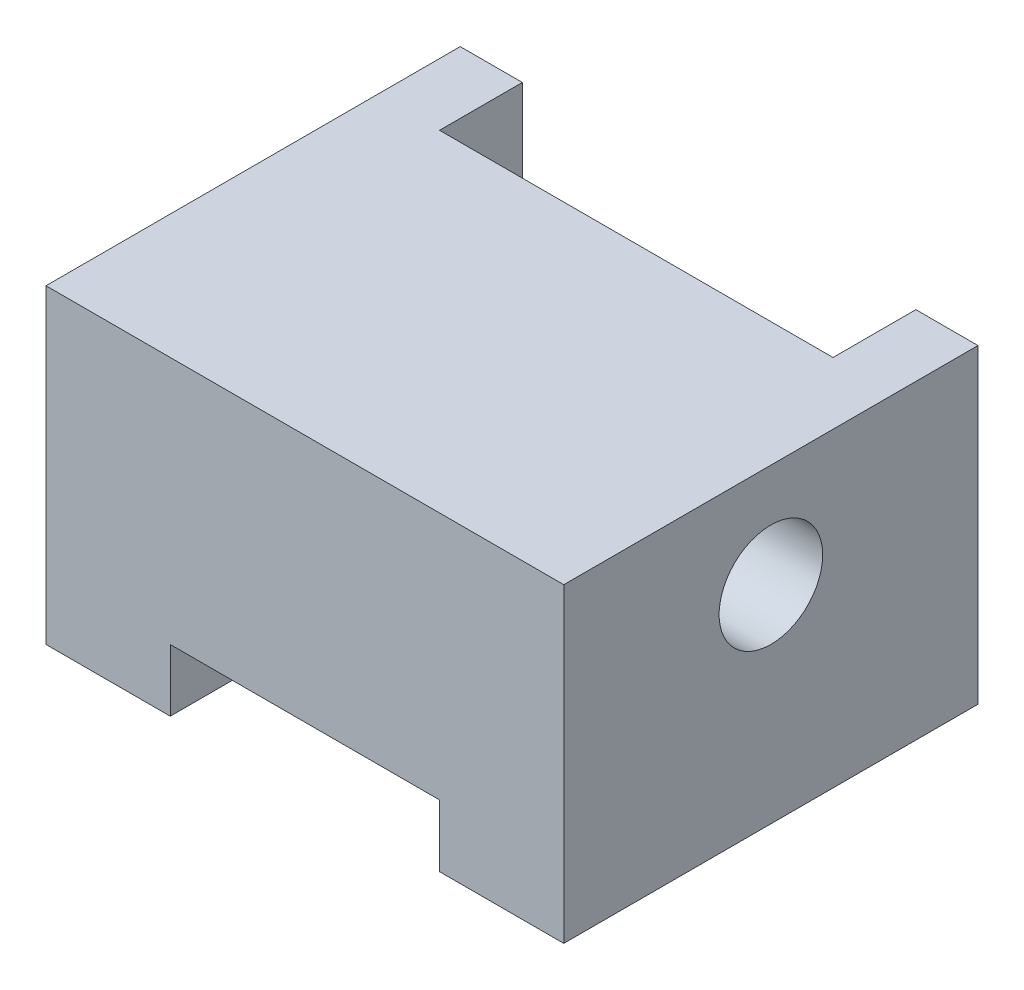
ISO-10303-21;
HEADER;
FILE_DESCRIPTION(('STEP AP214'),'2;1');
FILE_NAME('part.step','',(''),(''),'','','');
FILE_SCHEMA(('AUTOMOTIVE_DESIGN { 1 0 10303 214 1 1 1 1 }'));
ENDSEC;
DATA;
#1=APPLICATION_CONTEXT('core data for automotive mechanical design processes');
#2=APPLICATION_PROTOCOL_DEFINITION('international standard','automotive_design',2000,#1);
#3=PRODUCT_CONTEXT('',#1,'mechanical');
#4=PRODUCT('Part','Part','',(#3));
#5=PRODUCT_RELATED_PRODUCT_CATEGORY('part','',(#4));
#6=PRODUCT_DEFINITION_FORMATION('','',#4);
#7=PRODUCT_DEFINITION_CONTEXT('part definition',#1,'design');
#8=PRODUCT_DEFINITION('design','',#6,#7);
#9=PRODUCT_DEFINITION_SHAPE('','',#8);
#10=(LENGTH_UNIT() NAMED_UNIT(*) SI_UNIT(.MILLI.,.METRE.));
#11=(NAMED_UNIT(*) PLANE_ANGLE_UNIT() SI_UNIT($,.RADIAN.));
#12=(NAMED_UNIT(*) SI_UNIT($,.STERADIAN.) SOLID_ANGLE_UNIT());
#13=UNCERTAINTY_MEASURE_WITH_UNIT(LENGTH_MEASURE(1.E-05),#10,'distance_accuracy_value','');
#14=(GEOMETRIC_REPRESENTATION_CONTEXT(3) GLOBAL_UNCERTAINTY_ASSIGNED_CONTEXT((#13)) GLOBAL_UNIT_ASSIGNED_CONTEXT((#10,
#11,#12)) REPRESENTATION_CONTEXT('',''));
#15=CARTESIAN_POINT('',(0.,0.,0.));
#16=DIRECTION('',(0.,0.,1.));
#17=DIRECTION('',(1.,0.,0.));
#18=AXIS2_PLACEMENT_3D('',#15,#16,#17);
#19=CARTESIAN_POINT('',(0.,0.,-20.));
#20=DIRECTION('',(0.,0.,-1.));
#21=DIRECTION('',(-1.,0.,0.));
#22=AXIS2_PLACEMENT_3D('',#19,#20,#21);
#23=PLANE('',#22);
#24=DIRECTION('',(0.,1.,0.));
#25=VECTOR('',#24,1.);
#26=CARTESIAN_POINT('',(-19.,-15.,-20.));
#27=LINE('',#26,#25);
#28=CARTESIAN_POINT('',(-19.,-15.,-20.));
#29=VERTEX_POINT('',#28);
#30=CARTESIAN_POINT('',(-19.,15.,-20.));
#31=VERTEX_POINT('',#30);
#32=EDGE_CURVE('E167',#29,#31,#27,.T.);
#33=ORIENTED_EDGE('',*,*,#32,.F.);
#34=DIRECTION('',(1.,0.,0.));
#35=VECTOR('',#34,1.);
#36=CARTESIAN_POINT('',(-25.,-15.,-20.));
#37=LINE('',#36,#35);
#38=CARTESIAN_POINT('',(-25.,-15.,-20.));
#39=VERTEX_POINT('',#38);
#40=EDGE_CURVE('E153',#39,#29,#37,.T.);
#41=ORIENTED_EDGE('',*,*,#40,.F.);
#42=DIRECTION('',(0.,1.,0.));
#43=VECTOR('',#42,1.);
#44=CARTESIAN_POINT('',(-25.,-15.,-20.));
#45=LINE('',#44,#43);
#46=CARTESIAN_POINT('',(-25.,15.,-20.));
#47=VERTEX_POINT('',#46);
#48=EDGE_CURVE('E193',#39,#47,#45,.T.);
#49=ORIENTED_EDGE('',*,*,#48,.T.);
#50=DIRECTION('',(1.,0.,0.));
#51=VECTOR('',#50,1.);
#52=CARTESIAN_POINT('',(-25.,15.,-20.));
#53=LINE('',#52,#51);
#54=EDGE_CURVE('E207',#47,#31,#53,.T.);
#55=ORIENTED_EDGE('',*,*,#54,.T.);
#56=EDGE_LOOP('',(#33,#41,#49,#55));
#57=FACE_BOUND('',#56,.T.);
#58=ADVANCED_FACE('F37',(#57),#23,.T.);
#59=CARTESIAN_POINT('',(-25.,-15.,20.));
#60=DIRECTION('',(0.,1.,0.));
#61=DIRECTION('',(0.,0.,1.));
#62=AXIS2_PLACEMENT_3D('',#59,#60,#61);
#63=PLANE('',#62);
#64=ORIENTED_EDGE('',*,*,#40,.T.);
#65=DIRECTION('',(0.,0.,1.));
#66=VECTOR('',#65,1.);
#67=CARTESIAN_POINT('',(-19.,-15.,-20.));
#68=LINE('',#67,#66);
#69=CARTESIAN_POINT('',(-19.,-15.,-12.));
#70=VERTEX_POINT('',#69);
#71=EDGE_CURVE('E136',#29,#70,#68,.T.);
#72=ORIENTED_EDGE('',*,*,#71,.T.);
#73=DIRECTION('',(1.,0.,0.));
#74=VECTOR('',#73,1.);
#75=CARTESIAN_POINT('',(-19.,-15.,-12.));
#76=LINE('',#75,#74);
#77=CARTESIAN_POINT('',(-13.,-15.,-12.));
#78=VERTEX_POINT('',#77);
#79=EDGE_CURVE('E146',#70,#78,#76,.T.);
#80=ORIENTED_EDGE('',*,*,#79,.T.);
#81=DIRECTION('',(0.,0.,1.));
#82=VECTOR('',#81,1.);
#83=CARTESIAN_POINT('',(-13.,-15.,-20.));
#84=LINE('',#83,#82);
#85=CARTESIAN_POINT('',(-13.,-15.,20.));
#86=VERTEX_POINT('',#85);
#87=EDGE_CURVE('E185',#78,#86,#84,.T.);
#88=ORIENTED_EDGE('',*,*,#87,.T.);
#89=DIRECTION('',(1.,0.,0.));
#90=VECTOR('',#89,1.);
#91=CARTESIAN_POINT('',(-25.,-15.,20.));
#92=LINE('',#91,#90);
#93=CARTESIAN_POINT('',(-25.,-15.,20.));
#94=VERTEX_POINT('',#93);
#95=EDGE_CURVE('E201',#94,#86,#92,.T.);
#96=ORIENTED_EDGE('',*,*,#95,.F.);
#97=DIRECTION('',(0.,0.,-1.));
#98=VECTOR('',#97,1.);
#99=CARTESIAN_POINT('',(-25.,-15.,20.));
#100=LINE('',#99,#98);
#101=EDGE_CURVE('E45',#94,#39,#100,.T.);
#102=ORIENTED_EDGE('',*,*,#101,.T.);
#103=EDGE_LOOP('',(#64,#72,#80,#88,#96,#102));
#104=FACE_BOUND('',#103,.T.);
#105=ADVANCED_FACE('F152',(#104),#63,.F.);
#106=CARTESIAN_POINT('',(0.,0.,20.));
#107=DIRECTION('',(0.,0.,-1.));
#108=DIRECTION('',(-1.,0.,0.));
#109=AXIS2_PLACEMENT_3D('',#106,#107,#108);
#110=PLANE('',#109);
#111=DIRECTION('',(0.,1.,0.));
#112=VECTOR('',#111,1.);
#113=CARTESIAN_POINT('',(-13.,-15.,20.));
#114=LINE('',#113,#112);
#115=CARTESIAN_POINT('',(-13.,-9.,20.));
#116=VERTEX_POINT('',#115);
#117=EDGE_CURVE('E176',#86,#116,#114,.T.);
#118=ORIENTED_EDGE('',*,*,#117,.T.);
#119=DIRECTION('',(1.,0.,0.));
#120=VECTOR('',#119,1.);
#121=CARTESIAN_POINT('',(-13.,-9.,20.));
#122=LINE('',#121,#120);
#123=CARTESIAN_POINT('',(13.,-9.,20.));
#124=VERTEX_POINT('',#123);
#125=EDGE_CURVE('E179',#116,#124,#122,.T.);
#126=ORIENTED_EDGE('',*,*,#125,.T.);
#127=DIRECTION('',(0.,1.,0.));
#128=VECTOR('',#127,1.);
#129=CARTESIAN_POINT('',(13.,-15.,20.));
#130=LINE('',#129,#128);
#131=CARTESIAN_POINT('',(13.,-15.,20.));
#132=VERTEX_POINT('',#131);
#133=EDGE_CURVE('E182',#132,#124,#130,.T.);
#134=ORIENTED_EDGE('',*,*,#133,.F.);
#135=CARTESIAN_POINT('',(25.,-15.,20.));
#136=VERTEX_POINT('',#135);
#137=EDGE_CURVE('E200',#132,#136,#92,.T.);
#138=ORIENTED_EDGE('',*,*,#137,.T.);
#139=DIRECTION('',(0.,1.,0.));
#140=VECTOR('',#139,1.);
#141=CARTESIAN_POINT('',(25.,-15.,20.));
#142=LINE('',#141,#140);
#143=CARTESIAN_POINT('',(25.,15.,20.));
#144=VERTEX_POINT('',#143);
#145=EDGE_CURVE('E198',#136,#144,#142,.T.);
#146=ORIENTED_EDGE('',*,*,#145,.T.);
#147=DIRECTION('',(1.,0.,0.));
#148=VECTOR('',#147,1.);
#149=CARTESIAN_POINT('',(-25.,15.,20.));
#150=LINE('',#149,#148);
#151=CARTESIAN_POINT('',(-25.,15.,20.));
#152=VERTEX_POINT('',#151);
#153=EDGE_CURVE('E196',#152,#144,#150,.T.);
#154=ORIENTED_EDGE('',*,*,#153,.F.);
#155=DIRECTION('',(0.,1.,0.));
#156=VECTOR('',#155,1.);
#157=CARTESIAN_POINT('',(-25.,-15.,20.));
#158=LINE('',#157,#156);
#159=EDGE_CURVE('E194',#94,#152,#158,.T.);
#160=ORIENTED_EDGE('',*,*,#159,.F.);
#161=ORIENTED_EDGE('',*,*,#95,.T.);
#162=EDGE_LOOP('',(#118,#126,#134,#138,#146,#154,#160,#161));
#163=FACE_BOUND('',#162,.T.);
#164=ADVANCED_FACE('F230',(#163),#110,.F.);
#165=DIRECTION('',(0.,1.,0.));
#166=VECTOR('',#165,1.);
#167=CARTESIAN_POINT('',(19.,-15.,-20.));
#168=LINE('',#167,#166);
#169=CARTESIAN_POINT('',(19.,-15.,-20.));
#170=VERTEX_POINT('',#169);
#171=CARTESIAN_POINT('',(19.,15.,-20.));
#172=VERTEX_POINT('',#171);
#173=EDGE_CURVE('E170',#170,#172,#168,.T.);
#174=ORIENTED_EDGE('',*,*,#173,.T.);
#175=CARTESIAN_POINT('',(25.,15.,-20.));
#176=VERTEX_POINT('',#175);
#177=EDGE_CURVE('E206',#172,#176,#53,.T.);
#178=ORIENTED_EDGE('',*,*,#177,.T.);
#179=DIRECTION('',(0.,1.,0.));
#180=VECTOR('',#179,1.);
#181=CARTESIAN_POINT('',(25.,-15.,-20.));
#182=LINE('',#181,#180);
#183=CARTESIAN_POINT('',(25.,-15.,-20.));
#184=VERTEX_POINT('',#183);
#185=EDGE_CURVE('E210',#184,#176,#182,.T.);
#186=ORIENTED_EDGE('',*,*,#185,.F.);
#187=EDGE_CURVE('E213',#170,#184,#37,.T.);
#188=ORIENTED_EDGE('',*,*,#187,.F.);
#189=EDGE_LOOP('',(#174,#178,#186,#188));
#190=FACE_BOUND('',#189,.T.);
#191=ADVANCED_FACE('F226',(#190),#23,.T.);
#192=CARTESIAN_POINT('',(-25.,-15.,20.));
#193=DIRECTION('',(-1.,0.,0.));
#194=DIRECTION('',(0.,0.,1.));
#195=AXIS2_PLACEMENT_3D('',#192,#193,#194);
#196=PLANE('',#195);
#197=ORIENTED_EDGE('',*,*,#48,.F.);
#198=ORIENTED_EDGE('',*,*,#101,.F.);
#199=ORIENTED_EDGE('',*,*,#159,.T.);
#200=DIRECTION('',(0.,0.,-1.));
#201=VECTOR('',#200,1.);
#202=CARTESIAN_POINT('',(-25.,15.,20.));
#203=LINE('',#202,#201);
#204=EDGE_CURVE('E85',#152,#47,#203,.T.);
#205=ORIENTED_EDGE('',*,*,#204,.T.);
#206=EDGE_LOOP('',(#197,#198,#199,#205));
#207=FACE_BOUND('',#206,.T.);
#208=ADVANCED_FACE('F39',(#207),#196,.T.);
#209=CARTESIAN_POINT('',(13.,-15.,-12.));
#210=VERTEX_POINT('',#209);
#211=CARTESIAN_POINT('',(19.,-15.,-12.));
#212=VERTEX_POINT('',#211);
#213=EDGE_CURVE('E52',#210,#212,#76,.T.);
#214=ORIENTED_EDGE('',*,*,#213,.T.);
#215=DIRECTION('',(0.,0.,-1.));
#216=VECTOR('',#215,1.);
#217=CARTESIAN_POINT('',(19.,-15.,-20.));
#218=LINE('',#217,#216);
#219=EDGE_CURVE('E143',#212,#170,#218,.T.);
#220=ORIENTED_EDGE('',*,*,#219,.T.);
#221=ORIENTED_EDGE('',*,*,#187,.T.);
#222=DIRECTION('',(0.,0.,-1.));
#223=VECTOR('',#222,1.);
#224=CARTESIAN_POINT('',(25.,-15.,20.));
#225=LINE('',#224,#223);
#226=EDGE_CURVE('E216',#136,#184,#225,.T.);
#227=ORIENTED_EDGE('',*,*,#226,.F.);
#228=ORIENTED_EDGE('',*,*,#137,.F.);
#229=DIRECTION('',(0.,0.,1.));
#230=VECTOR('',#229,1.);
#231=CARTESIAN_POINT('',(13.,-15.,-20.));
#232=LINE('',#231,#230);
#233=EDGE_CURVE('E187',#210,#132,#232,.T.);
#234=ORIENTED_EDGE('',*,*,#233,.F.);
#235=EDGE_LOOP('',(#214,#220,#221,#227,#228,#234));
#236=FACE_BOUND('',#235,.T.);
#237=ADVANCED_FACE('F232',(#236),#63,.F.);
#238=CARTESIAN_POINT('',(25.,-15.,20.));
#239=DIRECTION('',(-1.,0.,0.));
#240=DIRECTION('',(0.,0.,1.));
#241=AXIS2_PLACEMENT_3D('',#238,#239,#240);
#242=PLANE('',#241);
#243=CARTESIAN_POINT('',(25.,5.,0.));
#244=DIRECTION('',(1.,0.,0.));
#245=DIRECTION('',(0.,0.,-1.));
#246=AXIS2_PLACEMENT_3D('',#243,#244,#245);
#247=CIRCLE('',#246,5.);
#248=CARTESIAN_POINT('',(25.,5.,-5.));
#249=VERTEX_POINT('',#248);
#250=EDGE_CURVE('E159',#249,#249,#247,.T.);
#251=ORIENTED_EDGE('',*,*,#250,.F.);
#252=EDGE_LOOP('',(#251));
#253=FACE_BOUND('',#252,.T.);
#254=ORIENTED_EDGE('',*,*,#185,.T.);
#255=DIRECTION('',(0.,0.,-1.));
#256=VECTOR('',#255,1.);
#257=CARTESIAN_POINT('',(25.,15.,20.));
#258=LINE('',#257,#256);
#259=EDGE_CURVE('E219',#144,#176,#258,.T.);
#260=ORIENTED_EDGE('',*,*,#259,.F.);
#261=ORIENTED_EDGE('',*,*,#145,.F.);
#262=ORIENTED_EDGE('',*,*,#226,.T.);
#263=EDGE_LOOP('',(#254,#260,#261,#262));
#264=FACE_BOUND('',#263,.T.);
#265=ADVANCED_FACE('F250',(#253,#264),#242,.F.);
#266=CARTESIAN_POINT('',(-25.,15.,20.));
#267=DIRECTION('',(0.,1.,0.));
#268=DIRECTION('',(0.,0.,1.));
#269=AXIS2_PLACEMENT_3D('',#266,#267,#268);
#270=PLANE('',#269);
#271=DIRECTION('',(0.,0.,1.));
#272=VECTOR('',#271,1.);
#273=CARTESIAN_POINT('',(-19.,15.,-20.));
#274=LINE('',#273,#272);
#275=CARTESIAN_POINT('',(-19.,15.,-12.));
#276=VERTEX_POINT('',#275);
#277=EDGE_CURVE('E139',#31,#276,#274,.T.);
#278=ORIENTED_EDGE('',*,*,#277,.F.);
#279=ORIENTED_EDGE('',*,*,#54,.F.);
#280=ORIENTED_EDGE('',*,*,#204,.F.);
#281=ORIENTED_EDGE('',*,*,#153,.T.);
#282=ORIENTED_EDGE('',*,*,#259,.T.);
#283=ORIENTED_EDGE('',*,*,#177,.F.);
#284=DIRECTION('',(0.,0.,-1.));
#285=VECTOR('',#284,1.);
#286=CARTESIAN_POINT('',(19.,15.,-20.));
#287=LINE('',#286,#285);
#288=CARTESIAN_POINT('',(19.,15.,-12.));
#289=VERTEX_POINT('',#288);
#290=EDGE_CURVE('E154',#289,#172,#287,.T.);
#291=ORIENTED_EDGE('',*,*,#290,.F.);
#292=DIRECTION('',(1.,0.,0.));
#293=VECTOR('',#292,1.);
#294=CARTESIAN_POINT('',(-19.,15.,-12.));
#295=LINE('',#294,#293);
#296=EDGE_CURVE('E156',#276,#289,#295,.T.);
#297=ORIENTED_EDGE('',*,*,#296,.F.);
#298=EDGE_LOOP('',(#278,#279,#280,#281,#282,#283,#291,#297));
#299=FACE_BOUND('',#298,.T.);
#300=ADVANCED_FACE('F222',(#299),#270,.T.);
#301=CARTESIAN_POINT('',(-13.,-15.,-20.));
#302=DIRECTION('',(1.,0.,0.));
#303=DIRECTION('',(0.,0.,-1.));
#304=AXIS2_PLACEMENT_3D('',#301,#302,#303);
#305=PLANE('',#304);
#306=DIRECTION('',(0.,-1.,0.));
#307=VECTOR('',#306,1.);
#308=CARTESIAN_POINT('',(-13.,-15.,-12.));
#309=LINE('',#308,#307);
#310=CARTESIAN_POINT('',(-13.,-9.,-12.));
#311=VERTEX_POINT('',#310);
#312=EDGE_CURVE('E149',#311,#78,#309,.T.);
#313=ORIENTED_EDGE('',*,*,#312,.F.);
#314=DIRECTION('',(0.,0.,1.));
#315=VECTOR('',#314,1.);
#316=CARTESIAN_POINT('',(-13.,-9.,-20.));
#317=LINE('',#316,#315);
#318=EDGE_CURVE('E191',#311,#116,#317,.T.);
#319=ORIENTED_EDGE('',*,*,#318,.T.);
#320=ORIENTED_EDGE('',*,*,#117,.F.);
#321=ORIENTED_EDGE('',*,*,#87,.F.);
#322=EDGE_LOOP('',(#313,#319,#320,#321));
#323=FACE_BOUND('',#322,.T.);
#324=ADVANCED_FACE('F275',(#323),#305,.T.);
#325=CARTESIAN_POINT('',(-13.,-9.,-20.));
#326=DIRECTION('',(0.,-1.,0.));
#327=DIRECTION('',(0.,0.,-1.));
#328=AXIS2_PLACEMENT_3D('',#325,#326,#327);
#329=PLANE('',#328);
#330=DIRECTION('',(-1.,0.,0.));
#331=VECTOR('',#330,1.);
#332=CARTESIAN_POINT('',(-13.,-9.,-12.));
#333=LINE('',#332,#331);
#334=CARTESIAN_POINT('',(13.,-9.,-12.));
#335=VERTEX_POINT('',#334);
#336=EDGE_CURVE('E169',#335,#311,#333,.T.);
#337=ORIENTED_EDGE('',*,*,#336,.F.);
#338=DIRECTION('',(0.,0.,1.));
#339=VECTOR('',#338,1.);
#340=CARTESIAN_POINT('',(13.,-9.,-20.));
#341=LINE('',#340,#339);
#342=EDGE_CURVE('E189',#335,#124,#341,.T.);
#343=ORIENTED_EDGE('',*,*,#342,.T.);
#344=ORIENTED_EDGE('',*,*,#125,.F.);
#345=ORIENTED_EDGE('',*,*,#318,.F.);
#346=EDGE_LOOP('',(#337,#343,#344,#345));
#347=FACE_BOUND('',#346,.T.);
#348=ADVANCED_FACE('F271',(#347),#329,.T.);
#349=CARTESIAN_POINT('',(13.,-15.,-20.));
#350=DIRECTION('',(1.,0.,0.));
#351=DIRECTION('',(0.,0.,-1.));
#352=AXIS2_PLACEMENT_3D('',#349,#350,#351);
#353=PLANE('',#352);
#354=ORIENTED_EDGE('',*,*,#342,.F.);
#355=DIRECTION('',(0.,-1.,0.));
#356=VECTOR('',#355,1.);
#357=CARTESIAN_POINT('',(13.,-15.,-12.));
#358=LINE('',#357,#356);
#359=EDGE_CURVE('E11',#335,#210,#358,.T.);
#360=ORIENTED_EDGE('',*,*,#359,.T.);
#361=ORIENTED_EDGE('',*,*,#233,.T.);
#362=ORIENTED_EDGE('',*,*,#133,.T.);
#363=EDGE_LOOP('',(#354,#360,#361,#362));
#364=FACE_BOUND('',#363,.T.);
#365=ADVANCED_FACE('F264',(#364),#353,.F.);
#366=CARTESIAN_POINT('',(-19.,-15.,-20.));
#367=DIRECTION('',(-1.,0.,0.));
#368=DIRECTION('',(0.,0.,1.));
#369=AXIS2_PLACEMENT_3D('',#366,#367,#368);
#370=PLANE('',#369);
#371=ORIENTED_EDGE('',*,*,#277,.T.);
#372=DIRECTION('',(0.,1.,0.));
#373=VECTOR('',#372,1.);
#374=CARTESIAN_POINT('',(-19.,-15.,-12.));
#375=LINE('',#374,#373);
#376=EDGE_CURVE('E132',#70,#276,#375,.T.);
#377=ORIENTED_EDGE('',*,*,#376,.F.);
#378=ORIENTED_EDGE('',*,*,#71,.F.);
#379=ORIENTED_EDGE('',*,*,#32,.T.);
#380=EDGE_LOOP('',(#371,#377,#378,#379));
#381=FACE_BOUND('',#380,.T.);
#382=ADVANCED_FACE('F134',(#381),#370,.F.);
#383=CARTESIAN_POINT('',(19.,-15.,-20.));
#384=DIRECTION('',(1.,0.,0.));
#385=DIRECTION('',(0.,0.,-1.));
#386=AXIS2_PLACEMENT_3D('',#383,#384,#385);
#387=PLANE('',#386);
#388=ORIENTED_EDGE('',*,*,#290,.T.);
#389=ORIENTED_EDGE('',*,*,#173,.F.);
#390=ORIENTED_EDGE('',*,*,#219,.F.);
#391=DIRECTION('',(0.,1.,0.));
#392=VECTOR('',#391,1.);
#393=CARTESIAN_POINT('',(19.,-15.,-12.));
#394=LINE('',#393,#392);
#395=EDGE_CURVE('E142',#212,#289,#394,.T.);
#396=ORIENTED_EDGE('',*,*,#395,.T.);
#397=EDGE_LOOP('',(#388,#389,#390,#396));
#398=FACE_BOUND('',#397,.T.);
#399=ADVANCED_FACE('F255',(#398),#387,.F.);
#400=CARTESIAN_POINT('',(-19.,-15.,-12.));
#401=DIRECTION('',(0.,0.,1.));
#402=DIRECTION('',(1.,0.,0.));
#403=AXIS2_PLACEMENT_3D('',#400,#401,#402);
#404=PLANE('',#403);
#405=ORIENTED_EDGE('',*,*,#312,.T.);
#406=ORIENTED_EDGE('',*,*,#79,.F.);
#407=ORIENTED_EDGE('',*,*,#376,.T.);
#408=ORIENTED_EDGE('',*,*,#296,.T.);
#409=ORIENTED_EDGE('',*,*,#395,.F.);
#410=ORIENTED_EDGE('',*,*,#213,.F.);
#411=ORIENTED_EDGE('',*,*,#359,.F.);
#412=ORIENTED_EDGE('',*,*,#336,.T.);
#413=EDGE_LOOP('',(#405,#406,#407,#408,#409,#410,#411,#412));
#414=FACE_BOUND('',#413,.T.);
#415=ADVANCED_FACE('F147',(#414),#404,.F.);
#416=CARTESIAN_POINT('',(-2.,5.,0.));
#417=DIRECTION('',(1.,0.,0.));
#418=DIRECTION('',(0.,0.,-1.));
#419=AXIS2_PLACEMENT_3D('',#416,#417,#418);
#420=CYLINDRICAL_SURFACE('',#419,5.);
#421=CARTESIAN_POINT('',(-2.,5.,0.));
#422=DIRECTION('',(1.,0.,0.));
#423=DIRECTION('',(0.,0.,-1.));
#424=AXIS2_PLACEMENT_3D('',#421,#422,#423);
#425=CIRCLE('',#424,5.);
#426=CARTESIAN_POINT('',(-2.,5.,-5.));
#427=VERTEX_POINT('',#426);
#428=EDGE_CURVE('E165',#427,#427,#425,.T.);
#429=ORIENTED_EDGE('',*,*,#428,.F.);
#430=EDGE_LOOP('',(#429));
#431=FACE_BOUND('',#430,.T.);
#432=ORIENTED_EDGE('',*,*,#250,.T.);
#433=EDGE_LOOP('',(#432));
#434=FACE_BOUND('',#433,.T.);
#435=ADVANCED_FACE('F262',(#431,#434),#420,.F.);
#436=CARTESIAN_POINT('',(-2.,5.,0.));
#437=DIRECTION('',(1.,0.,0.));
#438=DIRECTION('',(0.,0.,-1.));
#439=AXIS2_PLACEMENT_3D('',#436,#437,#438);
#440=PLANE('',#439);
#441=ORIENTED_EDGE('',*,*,#428,.T.);
#442=EDGE_LOOP('',(#441));
#443=FACE_BOUND('',#442,.T.);
#444=ADVANCED_FACE('F315',(#443),#440,.T.);
#445=CLOSED_SHELL('',(#58,#105,#164,#191,#208,#237,#265,#300,#324,#348,#365,#382,#399,#415,#435,#444));
#446=MANIFOLD_SOLID_BREP('B2',#445);
#447=ADVANCED_BREP_SHAPE_REPRESENTATION('',(#18,#446),#14);
#448=SHAPE_DEFINITION_REPRESENTATION(#9,#447);
ENDSEC;
END-ISO-10303-21;
